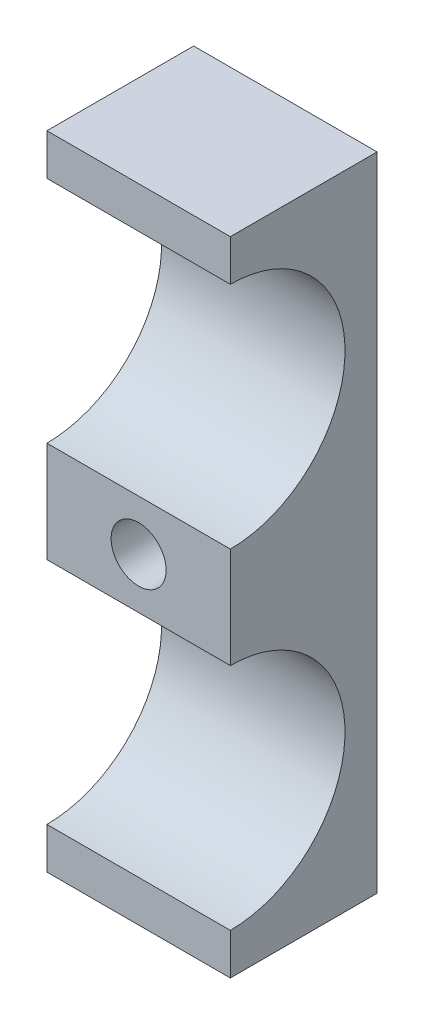
ISO-10303-21;
HEADER;
FILE_DESCRIPTION(('STEP AP214'),'2;1');
FILE_NAME('part.step','',(''),(''),'','','');
FILE_SCHEMA(('AUTOMOTIVE_DESIGN { 1 0 10303 214 1 1 1 1 }'));
ENDSEC;
DATA;
#1=APPLICATION_CONTEXT('core data for automotive mechanical design processes');
#2=APPLICATION_PROTOCOL_DEFINITION('international standard','automotive_design',2000,#1);
#3=PRODUCT_CONTEXT('',#1,'mechanical');
#4=PRODUCT('Part','Part','',(#3));
#5=PRODUCT_RELATED_PRODUCT_CATEGORY('part','',(#4));
#6=PRODUCT_DEFINITION_FORMATION('','',#4);
#7=PRODUCT_DEFINITION_CONTEXT('part definition',#1,'design');
#8=PRODUCT_DEFINITION('design','',#6,#7);
#9=PRODUCT_DEFINITION_SHAPE('','',#8);
#10=(LENGTH_UNIT() NAMED_UNIT(*) SI_UNIT(.MILLI.,.METRE.));
#11=(NAMED_UNIT(*) PLANE_ANGLE_UNIT() SI_UNIT($,.RADIAN.));
#12=(NAMED_UNIT(*) SI_UNIT($,.STERADIAN.) SOLID_ANGLE_UNIT());
#13=UNCERTAINTY_MEASURE_WITH_UNIT(LENGTH_MEASURE(1.E-05),#10,'distance_accuracy_value','');
#14=(GEOMETRIC_REPRESENTATION_CONTEXT(3) GLOBAL_UNCERTAINTY_ASSIGNED_CONTEXT((#13)) GLOBAL_UNIT_ASSIGNED_CONTEXT((#10,
#11,#12)) REPRESENTATION_CONTEXT('',''));
#15=CARTESIAN_POINT('',(0.,0.,0.));
#16=DIRECTION('',(0.,0.,1.));
#17=DIRECTION('',(1.,0.,0.));
#18=AXIS2_PLACEMENT_3D('',#15,#16,#17);
#19=CARTESIAN_POINT('',(0.,0.,16.));
#20=DIRECTION('',(0.,0.,-1.));
#21=DIRECTION('',(-1.,0.,0.));
#22=AXIS2_PLACEMENT_3D('',#19,#20,#21);
#23=PLANE('',#22);
#24=CARTESIAN_POINT('',(0.,0.,16.));
#25=DIRECTION('',(0.,0.,1.));
#26=DIRECTION('',(1.,0.,0.));
#27=AXIS2_PLACEMENT_3D('',#24,#25,#26);
#28=CIRCLE('',#27,3.);
#29=CARTESIAN_POINT('',(3.,0.,16.));
#30=VERTEX_POINT('',#29);
#31=EDGE_CURVE('E198',#30,#30,#28,.T.);
#32=ORIENTED_EDGE('',*,*,#31,.F.);
#33=EDGE_LOOP('',(#32));
#34=FACE_BOUND('',#33,.T.);
#35=DIRECTION('',(0.,1.,0.));
#36=VECTOR('',#35,1.);
#37=CARTESIAN_POINT('',(10.,-35.,16.));
#38=LINE('',#37,#36);
#39=CARTESIAN_POINT('',(10.,-5.5,16.));
#40=VERTEX_POINT('',#39);
#41=CARTESIAN_POINT('',(10.,5.5,16.));
#42=VERTEX_POINT('',#41);
#43=EDGE_CURVE('E186',#40,#42,#38,.T.);
#44=ORIENTED_EDGE('',*,*,#43,.T.);
#45=DIRECTION('',(-1.,0.,0.));
#46=VECTOR('',#45,1.);
#47=CARTESIAN_POINT('',(10.,5.5,16.));
#48=LINE('',#47,#46);
#49=CARTESIAN_POINT('',(-10.,5.5,16.));
#50=VERTEX_POINT('',#49);
#51=EDGE_CURVE('E11',#42,#50,#48,.T.);
#52=ORIENTED_EDGE('',*,*,#51,.T.);
#53=DIRECTION('',(0.,-1.,0.));
#54=VECTOR('',#53,1.);
#55=CARTESIAN_POINT('',(-10.,-35.,16.));
#56=LINE('',#55,#54);
#57=CARTESIAN_POINT('',(-10.,-5.5,16.));
#58=VERTEX_POINT('',#57);
#59=EDGE_CURVE('E131',#50,#58,#56,.T.);
#60=ORIENTED_EDGE('',*,*,#59,.T.);
#61=DIRECTION('',(-1.,0.,0.));
#62=VECTOR('',#61,1.);
#63=CARTESIAN_POINT('',(10.,-5.5,16.));
#64=LINE('',#63,#62);
#65=EDGE_CURVE('E109',#58,#40,#64,.F.);
#66=ORIENTED_EDGE('',*,*,#65,.T.);
#67=EDGE_LOOP('',(#44,#52,#60,#66));
#68=FACE_BOUND('',#67,.T.);
#69=ADVANCED_FACE('F41',(#34,#68),#23,.F.);
#70=CARTESIAN_POINT('',(10.,-35.,16.));
#71=VERTEX_POINT('',#70);
#72=CARTESIAN_POINT('',(10.,-30.5,16.));
#73=VERTEX_POINT('',#72);
#74=EDGE_CURVE('E123',#71,#73,#38,.T.);
#75=ORIENTED_EDGE('',*,*,#74,.T.);
#76=DIRECTION('',(-1.,0.,0.));
#77=VECTOR('',#76,1.);
#78=CARTESIAN_POINT('',(10.,-30.5,16.));
#79=LINE('',#78,#77);
#80=CARTESIAN_POINT('',(-10.,-30.5,16.));
#81=VERTEX_POINT('',#80);
#82=EDGE_CURVE('E108',#73,#81,#79,.T.);
#83=ORIENTED_EDGE('',*,*,#82,.T.);
#84=CARTESIAN_POINT('',(-10.,-35.,16.));
#85=VERTEX_POINT('',#84);
#86=EDGE_CURVE('E120',#81,#85,#56,.T.);
#87=ORIENTED_EDGE('',*,*,#86,.T.);
#88=DIRECTION('',(1.,0.,0.));
#89=VECTOR('',#88,1.);
#90=CARTESIAN_POINT('',(-10.,-35.,16.));
#91=LINE('',#90,#89);
#92=EDGE_CURVE('E141',#85,#71,#91,.T.);
#93=ORIENTED_EDGE('',*,*,#92,.T.);
#94=EDGE_LOOP('',(#75,#83,#87,#93));
#95=FACE_BOUND('',#94,.T.);
#96=ADVANCED_FACE('F119',(#95),#23,.F.);
#97=CARTESIAN_POINT('',(10.,-35.,16.));
#98=DIRECTION('',(-1.,0.,0.));
#99=DIRECTION('',(0.,0.,1.));
#100=AXIS2_PLACEMENT_3D('',#97,#98,#99);
#101=PLANE('',#100);
#102=CARTESIAN_POINT('',(10.,30.5,16.));
#103=VERTEX_POINT('',#102);
#104=CARTESIAN_POINT('',(10.,35.,16.));
#105=VERTEX_POINT('',#104);
#106=EDGE_CURVE('E163',#103,#105,#38,.T.);
#107=ORIENTED_EDGE('',*,*,#106,.F.);
#108=CARTESIAN_POINT('',(10.,18.,16.));
#109=DIRECTION('',(-1.,0.,0.));
#110=DIRECTION('',(0.,0.,1.));
#111=AXIS2_PLACEMENT_3D('',#108,#109,#110);
#112=CIRCLE('',#111,12.5);
#113=EDGE_CURVE('E57',#103,#42,#112,.T.);
#114=ORIENTED_EDGE('',*,*,#113,.T.);
#115=ORIENTED_EDGE('',*,*,#43,.F.);
#116=CARTESIAN_POINT('',(10.,-18.,16.));
#117=DIRECTION('',(-1.,0.,0.));
#118=DIRECTION('',(0.,0.,-1.));
#119=AXIS2_PLACEMENT_3D('',#116,#117,#118);
#120=CIRCLE('',#119,12.5);
#121=EDGE_CURVE('E65',#40,#73,#120,.T.);
#122=ORIENTED_EDGE('',*,*,#121,.T.);
#123=ORIENTED_EDGE('',*,*,#74,.F.);
#124=DIRECTION('',(0.,0.,-1.));
#125=VECTOR('',#124,1.);
#126=CARTESIAN_POINT('',(10.,-35.,16.));
#127=LINE('',#126,#125);
#128=CARTESIAN_POINT('',(10.,-35.,0.));
#129=VERTEX_POINT('',#128);
#130=EDGE_CURVE('E145',#71,#129,#127,.T.);
#131=ORIENTED_EDGE('',*,*,#130,.T.);
#132=DIRECTION('',(0.,1.,0.));
#133=VECTOR('',#132,1.);
#134=CARTESIAN_POINT('',(10.,-35.,0.));
#135=LINE('',#134,#133);
#136=CARTESIAN_POINT('',(10.,35.,0.));
#137=VERTEX_POINT('',#136);
#138=EDGE_CURVE('E151',#129,#137,#135,.T.);
#139=ORIENTED_EDGE('',*,*,#138,.T.);
#140=DIRECTION('',(0.,0.,-1.));
#141=VECTOR('',#140,1.);
#142=CARTESIAN_POINT('',(10.,35.,16.));
#143=LINE('',#142,#141);
#144=EDGE_CURVE('E171',#105,#137,#143,.T.);
#145=ORIENTED_EDGE('',*,*,#144,.F.);
#146=EDGE_LOOP('',(#107,#114,#115,#122,#123,#131,#139,#145));
#147=FACE_BOUND('',#146,.T.);
#148=ADVANCED_FACE('F43',(#147),#101,.F.);
#149=CARTESIAN_POINT('',(-10.,35.,16.));
#150=DIRECTION('',(0.,-1.,0.));
#151=DIRECTION('',(0.,0.,-1.));
#152=AXIS2_PLACEMENT_3D('',#149,#150,#151);
#153=PLANE('',#152);
#154=DIRECTION('',(-1.,0.,0.));
#155=VECTOR('',#154,1.);
#156=CARTESIAN_POINT('',(-10.,35.,0.));
#157=LINE('',#156,#155);
#158=CARTESIAN_POINT('',(-10.,35.,0.));
#159=VERTEX_POINT('',#158);
#160=EDGE_CURVE('E155',#137,#159,#157,.T.);
#161=ORIENTED_EDGE('',*,*,#160,.T.);
#162=DIRECTION('',(0.,0.,-1.));
#163=VECTOR('',#162,1.);
#164=CARTESIAN_POINT('',(-10.,35.,16.));
#165=LINE('',#164,#163);
#166=CARTESIAN_POINT('',(-10.,35.,16.));
#167=VERTEX_POINT('',#166);
#168=EDGE_CURVE('E167',#167,#159,#165,.T.);
#169=ORIENTED_EDGE('',*,*,#168,.F.);
#170=DIRECTION('',(-1.,0.,0.));
#171=VECTOR('',#170,1.);
#172=CARTESIAN_POINT('',(-10.,35.,16.));
#173=LINE('',#172,#171);
#174=EDGE_CURVE('E132',#105,#167,#173,.T.);
#175=ORIENTED_EDGE('',*,*,#174,.F.);
#176=ORIENTED_EDGE('',*,*,#144,.T.);
#177=EDGE_LOOP('',(#161,#169,#175,#176));
#178=FACE_BOUND('',#177,.T.);
#179=ADVANCED_FACE('F225',(#178),#153,.F.);
#180=CARTESIAN_POINT('',(-10.,-35.,16.));
#181=DIRECTION('',(1.,0.,0.));
#182=DIRECTION('',(0.,0.,-1.));
#183=AXIS2_PLACEMENT_3D('',#180,#181,#182);
#184=PLANE('',#183);
#185=ORIENTED_EDGE('',*,*,#59,.F.);
#186=CARTESIAN_POINT('',(-10.,18.,16.));
#187=DIRECTION('',(-1.,0.,0.));
#188=DIRECTION('',(0.,0.,1.));
#189=AXIS2_PLACEMENT_3D('',#186,#187,#188);
#190=CIRCLE('',#189,12.5);
#191=CARTESIAN_POINT('',(-10.,30.5,16.));
#192=VERTEX_POINT('',#191);
#193=EDGE_CURVE('E193',#192,#50,#190,.T.);
#194=ORIENTED_EDGE('',*,*,#193,.F.);
#195=EDGE_CURVE('E134',#167,#192,#56,.T.);
#196=ORIENTED_EDGE('',*,*,#195,.F.);
#197=ORIENTED_EDGE('',*,*,#168,.T.);
#198=DIRECTION('',(0.,-1.,0.));
#199=VECTOR('',#198,1.);
#200=CARTESIAN_POINT('',(-10.,-35.,0.));
#201=LINE('',#200,#199);
#202=CARTESIAN_POINT('',(-10.,-35.,0.));
#203=VERTEX_POINT('',#202);
#204=EDGE_CURVE('E158',#159,#203,#201,.T.);
#205=ORIENTED_EDGE('',*,*,#204,.T.);
#206=DIRECTION('',(0.,0.,-1.));
#207=VECTOR('',#206,1.);
#208=CARTESIAN_POINT('',(-10.,-35.,16.));
#209=LINE('',#208,#207);
#210=EDGE_CURVE('E128',#85,#203,#209,.T.);
#211=ORIENTED_EDGE('',*,*,#210,.F.);
#212=ORIENTED_EDGE('',*,*,#86,.F.);
#213=CARTESIAN_POINT('',(-10.,-18.,16.));
#214=DIRECTION('',(-1.,0.,0.));
#215=DIRECTION('',(0.,0.,-1.));
#216=AXIS2_PLACEMENT_3D('',#213,#214,#215);
#217=CIRCLE('',#216,12.5);
#218=EDGE_CURVE('E105',#58,#81,#217,.T.);
#219=ORIENTED_EDGE('',*,*,#218,.F.);
#220=EDGE_LOOP('',(#185,#194,#196,#197,#205,#211,#212,#219));
#221=FACE_BOUND('',#220,.T.);
#222=ADVANCED_FACE('F126',(#221),#184,.F.);
#223=CARTESIAN_POINT('',(-10.,-35.,16.));
#224=DIRECTION('',(0.,1.,0.));
#225=DIRECTION('',(0.,0.,1.));
#226=AXIS2_PLACEMENT_3D('',#223,#224,#225);
#227=PLANE('',#226);
#228=DIRECTION('',(1.,0.,0.));
#229=VECTOR('',#228,1.);
#230=CARTESIAN_POINT('',(-10.,-35.,0.));
#231=LINE('',#230,#229);
#232=EDGE_CURVE('E161',#203,#129,#231,.T.);
#233=ORIENTED_EDGE('',*,*,#232,.T.);
#234=ORIENTED_EDGE('',*,*,#130,.F.);
#235=ORIENTED_EDGE('',*,*,#92,.F.);
#236=ORIENTED_EDGE('',*,*,#210,.T.);
#237=EDGE_LOOP('',(#233,#234,#235,#236));
#238=FACE_BOUND('',#237,.T.);
#239=ADVANCED_FACE('F234',(#238),#227,.F.);
#240=ORIENTED_EDGE('',*,*,#195,.T.);
#241=DIRECTION('',(-1.,0.,0.));
#242=VECTOR('',#241,1.);
#243=CARTESIAN_POINT('',(10.,30.5,16.));
#244=LINE('',#243,#242);
#245=EDGE_CURVE('E50',#192,#103,#244,.F.);
#246=ORIENTED_EDGE('',*,*,#245,.T.);
#247=ORIENTED_EDGE('',*,*,#106,.T.);
#248=ORIENTED_EDGE('',*,*,#174,.T.);
#249=EDGE_LOOP('',(#240,#246,#247,#248));
#250=FACE_BOUND('',#249,.T.);
#251=ADVANCED_FACE('F178',(#250),#23,.F.);
#252=CARTESIAN_POINT('',(0.,0.,0.));
#253=DIRECTION('',(0.,0.,-1.));
#254=DIRECTION('',(-1.,0.,0.));
#255=AXIS2_PLACEMENT_3D('',#252,#253,#254);
#256=PLANE('',#255);
#257=CARTESIAN_POINT('',(0.,0.,0.));
#258=DIRECTION('',(0.,0.,1.));
#259=DIRECTION('',(1.,0.,0.));
#260=AXIS2_PLACEMENT_3D('',#257,#258,#259);
#261=CIRCLE('',#260,3.);
#262=CARTESIAN_POINT('',(3.,0.,0.));
#263=VERTEX_POINT('',#262);
#264=EDGE_CURVE('E115',#263,#263,#261,.T.);
#265=ORIENTED_EDGE('',*,*,#264,.T.);
#266=EDGE_LOOP('',(#265));
#267=FACE_BOUND('',#266,.T.);
#268=ORIENTED_EDGE('',*,*,#138,.F.);
#269=ORIENTED_EDGE('',*,*,#232,.F.);
#270=ORIENTED_EDGE('',*,*,#204,.F.);
#271=ORIENTED_EDGE('',*,*,#160,.F.);
#272=EDGE_LOOP('',(#268,#269,#270,#271));
#273=FACE_BOUND('',#272,.T.);
#274=ADVANCED_FACE('F206',(#267,#273),#256,.T.);
#275=CARTESIAN_POINT('',(10.,-18.,16.));
#276=DIRECTION('',(-1.,0.,0.));
#277=DIRECTION('',(0.,0.,1.));
#278=AXIS2_PLACEMENT_3D('',#275,#276,#277);
#279=CYLINDRICAL_SURFACE('',#278,12.5);
#280=ORIENTED_EDGE('',*,*,#121,.F.);
#281=ORIENTED_EDGE('',*,*,#65,.F.);
#282=ORIENTED_EDGE('',*,*,#218,.T.);
#283=ORIENTED_EDGE('',*,*,#82,.F.);
#284=EDGE_LOOP('',(#280,#281,#282,#283));
#285=FACE_BOUND('',#284,.T.);
#286=ADVANCED_FACE('F107',(#285),#279,.F.);
#287=CARTESIAN_POINT('',(10.,18.,16.));
#288=DIRECTION('',(-1.,0.,0.));
#289=DIRECTION('',(0.,0.,1.));
#290=AXIS2_PLACEMENT_3D('',#287,#288,#289);
#291=CYLINDRICAL_SURFACE('',#290,12.5);
#292=ORIENTED_EDGE('',*,*,#113,.F.);
#293=ORIENTED_EDGE('',*,*,#245,.F.);
#294=ORIENTED_EDGE('',*,*,#193,.T.);
#295=ORIENTED_EDGE('',*,*,#51,.F.);
#296=EDGE_LOOP('',(#292,#293,#294,#295));
#297=FACE_BOUND('',#296,.T.);
#298=ADVANCED_FACE('F212',(#297),#291,.F.);
#299=CARTESIAN_POINT('',(0.,0.,0.));
#300=DIRECTION('',(0.,0.,1.));
#301=DIRECTION('',(1.,0.,0.));
#302=AXIS2_PLACEMENT_3D('',#299,#300,#301);
#303=CYLINDRICAL_SURFACE('',#302,3.);
#304=ORIENTED_EDGE('',*,*,#264,.F.);
#305=EDGE_LOOP('',(#304));
#306=FACE_BOUND('',#305,.T.);
#307=ORIENTED_EDGE('',*,*,#31,.T.);
#308=EDGE_LOOP('',(#307));
#309=FACE_BOUND('',#308,.T.);
#310=ADVANCED_FACE('F209',(#306,#309),#303,.F.);
#311=CLOSED_SHELL('',(#69,#96,#148,#179,#222,#239,#251,#274,#286,#298,#310));
#312=MANIFOLD_SOLID_BREP('B2',#311);
#313=ADVANCED_BREP_SHAPE_REPRESENTATION('',(#18,#312),#14);
#314=SHAPE_DEFINITION_REPRESENTATION(#9,#313);
ENDSEC;
END-ISO-10303-21;
